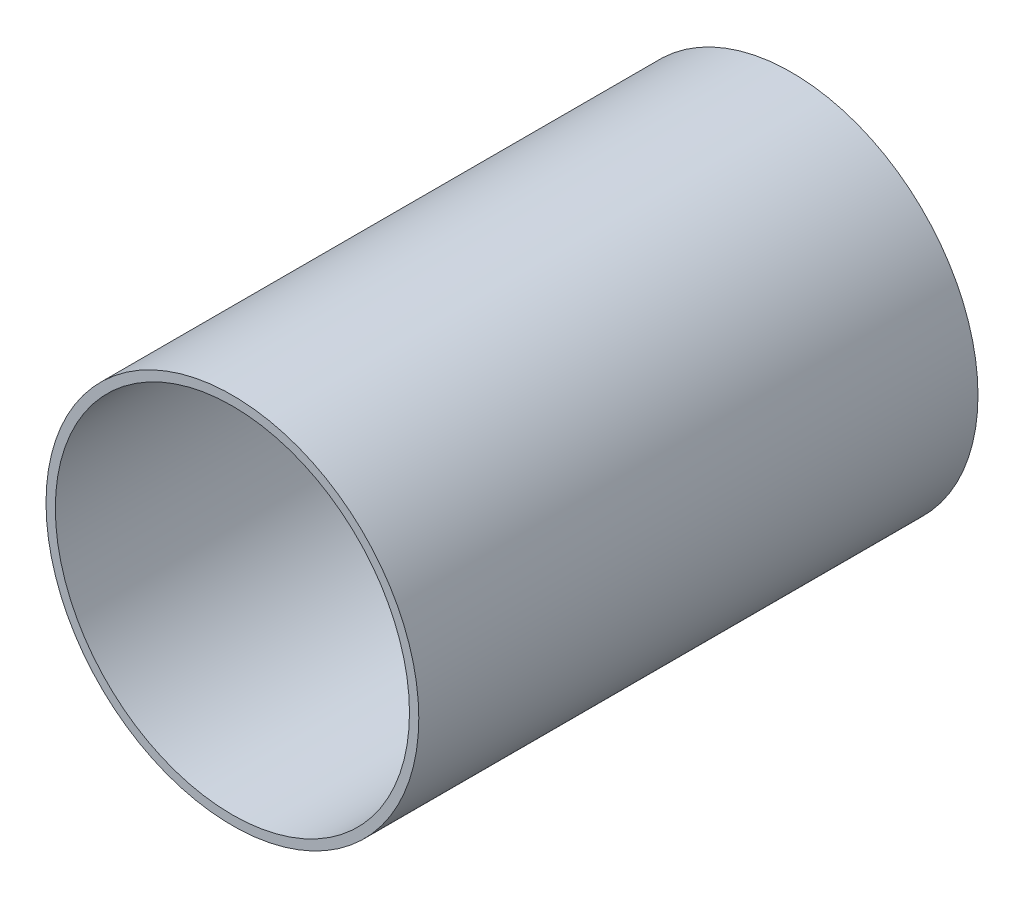
ISO-10303-21;
HEADER;
FILE_DESCRIPTION(('STEP AP214'),'2;1');
FILE_NAME('part.step','',(''),(''),'','','');
FILE_SCHEMA(('AUTOMOTIVE_DESIGN { 1 0 10303 214 1 1 1 1 }'));
ENDSEC;
DATA;
#1=APPLICATION_CONTEXT('core data for automotive mechanical design processes');
#2=APPLICATION_PROTOCOL_DEFINITION('international standard','automotive_design',2000,#1);
#3=PRODUCT_CONTEXT('',#1,'mechanical');
#4=PRODUCT('Part','Part','',(#3));
#5=PRODUCT_RELATED_PRODUCT_CATEGORY('part','',(#4));
#6=PRODUCT_DEFINITION_FORMATION('','',#4);
#7=PRODUCT_DEFINITION_CONTEXT('part definition',#1,'design');
#8=PRODUCT_DEFINITION('design','',#6,#7);
#9=PRODUCT_DEFINITION_SHAPE('','',#8);
#10=(LENGTH_UNIT() NAMED_UNIT(*) SI_UNIT(.MILLI.,.METRE.));
#11=(NAMED_UNIT(*) PLANE_ANGLE_UNIT() SI_UNIT($,.RADIAN.));
#12=(NAMED_UNIT(*) SI_UNIT($,.STERADIAN.) SOLID_ANGLE_UNIT());
#13=UNCERTAINTY_MEASURE_WITH_UNIT(LENGTH_MEASURE(1.E-05),#10,'distance_accuracy_value','');
#14=(GEOMETRIC_REPRESENTATION_CONTEXT(3) GLOBAL_UNCERTAINTY_ASSIGNED_CONTEXT((#13)) GLOBAL_UNIT_ASSIGNED_CONTEXT((#10,
#11,#12)) REPRESENTATION_CONTEXT('',''));
#15=CARTESIAN_POINT('',(0.,0.,0.));
#16=DIRECTION('',(0.,0.,1.));
#17=DIRECTION('',(1.,0.,0.));
#18=AXIS2_PLACEMENT_3D('',#15,#16,#17);
#19=CARTESIAN_POINT('',(0.,0.,30.));
#20=DIRECTION('',(0.,0.,1.));
#21=DIRECTION('',(1.,0.,0.));
#22=AXIS2_PLACEMENT_3D('',#19,#20,#21);
#23=PLANE('',#22);
#24=CARTESIAN_POINT('',(0.,0.,30.));
#25=DIRECTION('',(0.,0.,1.));
#26=DIRECTION('',(1.,0.,0.));
#27=AXIS2_PLACEMENT_3D('',#24,#25,#26);
#28=CIRCLE('',#27,10.);
#29=CARTESIAN_POINT('',(10.,0.,30.));
#30=VERTEX_POINT('',#29);
#31=EDGE_CURVE('E10',#30,#30,#28,.T.);
#32=ORIENTED_EDGE('',*,*,#31,.T.);
#33=EDGE_LOOP('',(#32));
#34=FACE_BOUND('',#33,.T.);
#35=CARTESIAN_POINT('',(0.,0.,30.));
#36=DIRECTION('',(0.,0.,1.));
#37=DIRECTION('',(1.,0.,0.));
#38=AXIS2_PLACEMENT_3D('',#35,#36,#37);
#39=CIRCLE('',#38,9.5);
#40=CARTESIAN_POINT('',(9.5,0.,30.));
#41=VERTEX_POINT('',#40);
#42=EDGE_CURVE('E43',#41,#41,#39,.T.);
#43=ORIENTED_EDGE('',*,*,#42,.F.);
#44=EDGE_LOOP('',(#43));
#45=FACE_BOUND('',#44,.T.);
#46=ADVANCED_FACE('F32',(#34,#45),#23,.T.);
#47=CARTESIAN_POINT('',(0.,0.,0.));
#48=DIRECTION('',(0.,0.,1.));
#49=DIRECTION('',(1.,0.,0.));
#50=AXIS2_PLACEMENT_3D('',#47,#48,#49);
#51=PLANE('',#50);
#52=CARTESIAN_POINT('',(0.,0.,0.));
#53=DIRECTION('',(0.,0.,1.));
#54=DIRECTION('',(1.,0.,0.));
#55=AXIS2_PLACEMENT_3D('',#52,#53,#54);
#56=CIRCLE('',#55,10.);
#57=CARTESIAN_POINT('',(10.,0.,0.));
#58=VERTEX_POINT('',#57);
#59=EDGE_CURVE('E36',#58,#58,#56,.T.);
#60=ORIENTED_EDGE('',*,*,#59,.F.);
#61=EDGE_LOOP('',(#60));
#62=FACE_BOUND('',#61,.T.);
#63=CARTESIAN_POINT('',(0.,0.,0.));
#64=DIRECTION('',(0.,0.,1.));
#65=DIRECTION('',(1.,0.,0.));
#66=AXIS2_PLACEMENT_3D('',#63,#64,#65);
#67=CIRCLE('',#66,9.5);
#68=CARTESIAN_POINT('',(9.5,0.,0.));
#69=VERTEX_POINT('',#68);
#70=EDGE_CURVE('E45',#69,#69,#67,.T.);
#71=ORIENTED_EDGE('',*,*,#70,.T.);
#72=EDGE_LOOP('',(#71));
#73=FACE_BOUND('',#72,.T.);
#74=ADVANCED_FACE('F55',(#62,#73),#51,.F.);
#75=CARTESIAN_POINT('',(0.,0.,30.));
#76=DIRECTION('',(0.,0.,-1.));
#77=DIRECTION('',(-1.,0.,0.));
#78=AXIS2_PLACEMENT_3D('',#75,#76,#77);
#79=CYLINDRICAL_SURFACE('',#78,10.);
#80=ORIENTED_EDGE('',*,*,#31,.F.);
#81=EDGE_LOOP('',(#80));
#82=FACE_BOUND('',#81,.T.);
#83=ORIENTED_EDGE('',*,*,#59,.T.);
#84=EDGE_LOOP('',(#83));
#85=FACE_BOUND('',#84,.T.);
#86=ADVANCED_FACE('F34',(#82,#85),#79,.T.);
#87=CARTESIAN_POINT('',(0.,0.,30.));
#88=DIRECTION('',(0.,0.,-1.));
#89=DIRECTION('',(-1.,0.,0.));
#90=AXIS2_PLACEMENT_3D('',#87,#88,#89);
#91=CYLINDRICAL_SURFACE('',#90,9.5);
#92=ORIENTED_EDGE('',*,*,#42,.T.);
#93=EDGE_LOOP('',(#92));
#94=FACE_BOUND('',#93,.T.);
#95=ORIENTED_EDGE('',*,*,#70,.F.);
#96=EDGE_LOOP('',(#95));
#97=FACE_BOUND('',#96,.T.);
#98=ADVANCED_FACE('F51',(#94,#97),#91,.F.);
#99=CLOSED_SHELL('',(#46,#74,#86,#98));
#100=MANIFOLD_SOLID_BREP('B2',#99);
#101=ADVANCED_BREP_SHAPE_REPRESENTATION('',(#18,#100),#14);
#102=SHAPE_DEFINITION_REPRESENTATION(#9,#101);
ENDSEC;
END-ISO-10303-21;
